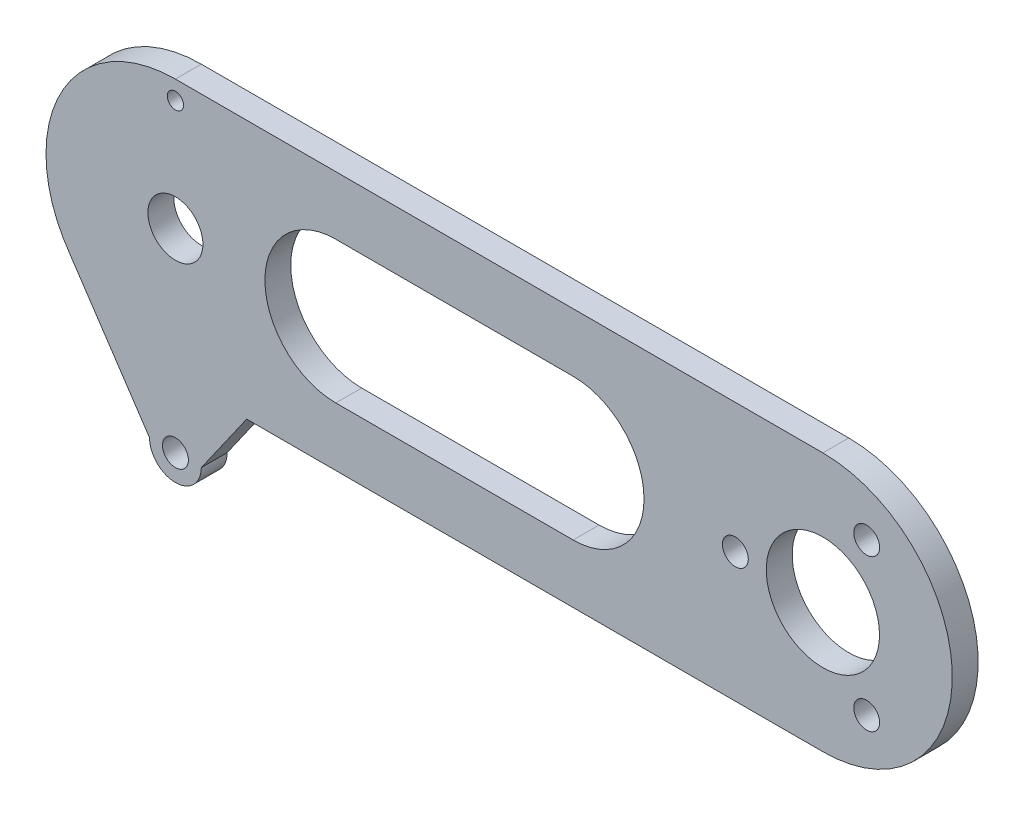
ISO-10303-21;
HEADER;
FILE_DESCRIPTION(('STEP AP214'),'2;1');
FILE_NAME('part.step','',(''),(''),'','','');
FILE_SCHEMA(('AUTOMOTIVE_DESIGN { 1 0 10303 214 1 1 1 1 }'));
ENDSEC;
DATA;
#1=APPLICATION_CONTEXT('core data for automotive mechanical design processes');
#2=APPLICATION_PROTOCOL_DEFINITION('international standard','automotive_design',2000,#1);
#3=PRODUCT_CONTEXT('',#1,'mechanical');
#4=PRODUCT('Part','Part','',(#3));
#5=PRODUCT_RELATED_PRODUCT_CATEGORY('part','',(#4));
#6=PRODUCT_DEFINITION_FORMATION('','',#4);
#7=PRODUCT_DEFINITION_CONTEXT('part definition',#1,'design');
#8=PRODUCT_DEFINITION('design','',#6,#7);
#9=PRODUCT_DEFINITION_SHAPE('','',#8);
#10=(LENGTH_UNIT() NAMED_UNIT(*) SI_UNIT(.MILLI.,.METRE.));
#11=(NAMED_UNIT(*) PLANE_ANGLE_UNIT() SI_UNIT($,.RADIAN.));
#12=(NAMED_UNIT(*) SI_UNIT($,.STERADIAN.) SOLID_ANGLE_UNIT());
#13=UNCERTAINTY_MEASURE_WITH_UNIT(LENGTH_MEASURE(1.E-05),#10,'distance_accuracy_value','');
#14=(GEOMETRIC_REPRESENTATION_CONTEXT(3) GLOBAL_UNCERTAINTY_ASSIGNED_CONTEXT((#13)) GLOBAL_UNIT_ASSIGNED_CONTEXT((#10,
#11,#12)) REPRESENTATION_CONTEXT('',''));
#15=CARTESIAN_POINT('',(0.,0.,0.));
#16=DIRECTION('',(0.,0.,1.));
#17=DIRECTION('',(1.,0.,0.));
#18=AXIS2_PLACEMENT_3D('',#15,#16,#17);
#19=CARTESIAN_POINT('',(-1.00000000000001,0.,4.));
#20=DIRECTION('',(0.,0.,-1.));
#21=DIRECTION('',(-1.,0.,0.));
#22=AXIS2_PLACEMENT_3D('',#19,#20,#21);
#23=PLANE('',#22);
#24=CARTESIAN_POINT('',(105.82929500564,11.7173237132035,4.));
#25=DIRECTION('',(0.,0.,1.));
#26=DIRECTION('',(1.,0.,0.));
#27=AXIS2_PLACEMENT_3D('',#24,#25,#26);
#28=CIRCLE('',#27,2.);
#29=CARTESIAN_POINT('',(107.82929500564,11.7173237132035,4.));
#30=VERTEX_POINT('',#29);
#31=EDGE_CURVE('E156',#30,#30,#28,.T.);
#32=ORIENTED_EDGE('',*,*,#31,.F.);
#33=EDGE_LOOP('',(#32));
#34=FACE_BOUND('',#33,.T.);
#35=CARTESIAN_POINT('',(-0.999999999999992,-30.,4.));
#36=DIRECTION('',(0.,0.,1.));
#37=DIRECTION('',(1.,0.,0.));
#38=AXIS2_PLACEMENT_3D('',#35,#36,#37);
#39=CIRCLE('',#38,2.);
#40=CARTESIAN_POINT('',(1.00000000000001,-30.,4.));
#41=VERTEX_POINT('',#40);
#42=EDGE_CURVE('E162',#41,#41,#39,.T.);
#43=ORIENTED_EDGE('',*,*,#42,.F.);
#44=EDGE_LOOP('',(#43));
#45=FACE_BOUND('',#44,.T.);
#46=CARTESIAN_POINT('',(85.5342950056397,0.,4.));
#47=DIRECTION('',(0.,0.,1.));
#48=DIRECTION('',(1.,0.,0.));
#49=AXIS2_PLACEMENT_3D('',#46,#47,#48);
#50=CIRCLE('',#49,2.);
#51=CARTESIAN_POINT('',(87.5342950056397,0.,4.));
#52=VERTEX_POINT('',#51);
#53=EDGE_CURVE('E168',#52,#52,#50,.T.);
#54=ORIENTED_EDGE('',*,*,#53,.F.);
#55=EDGE_LOOP('',(#54));
#56=FACE_BOUND('',#55,.T.);
#57=CARTESIAN_POINT('',(-0.999999999999996,0.,4.));
#58=DIRECTION('',(0.,0.,1.));
#59=DIRECTION('',(1.,0.,0.));
#60=AXIS2_PLACEMENT_3D('',#57,#58,#59);
#61=CIRCLE('',#60,4.25);
#62=CARTESIAN_POINT('',(3.25,0.,4.));
#63=VERTEX_POINT('',#62);
#64=EDGE_CURVE('E174',#63,#63,#61,.T.);
#65=ORIENTED_EDGE('',*,*,#64,.F.);
#66=EDGE_LOOP('',(#65));
#67=FACE_BOUND('',#66,.T.);
#68=CARTESIAN_POINT('',(-1.00000000000001,0.,4.));
#69=DIRECTION('',(0.,0.,1.));
#70=DIRECTION('',(-1.,0.,0.));
#71=AXIS2_PLACEMENT_3D('',#68,#69,#70);
#72=CIRCLE('',#71,20.);
#73=CARTESIAN_POINT('',(-1.,20.,4.));
#74=VERTEX_POINT('',#73);
#75=CARTESIAN_POINT('',(-17.2081561258522,-11.7173237132034,4.));
#76=VERTEX_POINT('',#75);
#77=EDGE_CURVE('E180',#74,#76,#72,.T.);
#78=ORIENTED_EDGE('',*,*,#77,.T.);
#79=DIRECTION('',(0.555320589704318,-0.83163636443487,0.));
#80=VECTOR('',#79,1.);
#81=CARTESIAN_POINT('',(-4.99999999999999,-30.,4.));
#82=LINE('',#81,#80);
#83=CARTESIAN_POINT('',(-4.99999999999999,-30.,4.));
#84=VERTEX_POINT('',#83);
#85=EDGE_CURVE('E183',#76,#84,#82,.T.);
#86=ORIENTED_EDGE('',*,*,#85,.T.);
#87=CARTESIAN_POINT('',(-0.999999999999992,-30.,4.));
#88=DIRECTION('',(0.,0.,1.));
#89=DIRECTION('',(1.,0.,0.));
#90=AXIS2_PLACEMENT_3D('',#87,#88,#89);
#91=CIRCLE('',#90,4.);
#92=CARTESIAN_POINT('',(3.00000000000001,-30.,4.));
#93=VERTEX_POINT('',#92);
#94=EDGE_CURVE('E186',#84,#93,#91,.T.);
#95=ORIENTED_EDGE('',*,*,#94,.T.);
#96=DIRECTION('',(0.574260620658506,0.818672547213419,0.));
#97=VECTOR('',#96,1.);
#98=CARTESIAN_POINT('',(3.00000000000001,-30.,4.));
#99=LINE('',#98,#97);
#100=CARTESIAN_POINT('',(10.0145337426198,-20.,4.));
#101=VERTEX_POINT('',#100);
#102=EDGE_CURVE('E188',#93,#101,#99,.T.);
#103=ORIENTED_EDGE('',*,*,#102,.T.);
#104=DIRECTION('',(1.,0.,0.));
#105=VECTOR('',#104,1.);
#106=CARTESIAN_POINT('',(10.0145337426198,-20.,4.));
#107=LINE('',#106,#105);
#108=CARTESIAN_POINT('',(99.0642950056397,-20.,4.));
#109=VERTEX_POINT('',#108);
#110=EDGE_CURVE('E190',#101,#109,#107,.T.);
#111=ORIENTED_EDGE('',*,*,#110,.T.);
#112=CARTESIAN_POINT('',(99.0642950056397,0.,4.));
#113=DIRECTION('',(0.,0.,1.));
#114=DIRECTION('',(-1.,0.,0.));
#115=AXIS2_PLACEMENT_3D('',#112,#113,#114);
#116=CIRCLE('',#115,20.);
#117=CARTESIAN_POINT('',(99.0642950056397,20.,4.));
#118=VERTEX_POINT('',#117);
#119=EDGE_CURVE('E192',#109,#118,#116,.T.);
#120=ORIENTED_EDGE('',*,*,#119,.T.);
#121=DIRECTION('',(-1.,0.,0.));
#122=VECTOR('',#121,1.);
#123=CARTESIAN_POINT('',(-1.,20.,4.));
#124=LINE('',#123,#122);
#125=EDGE_CURVE('E194',#118,#74,#124,.T.);
#126=ORIENTED_EDGE('',*,*,#125,.T.);
#127=EDGE_LOOP('',(#78,#86,#95,#103,#111,#120,#126));
#128=FACE_BOUND('',#127,.T.);
#129=CARTESIAN_POINT('',(23.7835213403292,0.,4.));
#130=DIRECTION('',(0.,0.,1.));
#131=DIRECTION('',(1.,0.,0.));
#132=AXIS2_PLACEMENT_3D('',#129,#130,#131);
#133=CIRCLE('',#132,10.953852889672);
#134=CARTESIAN_POINT('',(23.7835213403292,10.953852889672,4.));
#135=VERTEX_POINT('',#134);
#136=CARTESIAN_POINT('',(23.7835213403292,-10.953852889672,4.));
#137=VERTEX_POINT('',#136);
#138=EDGE_CURVE('E117',#135,#137,#133,.T.);
#139=ORIENTED_EDGE('',*,*,#138,.F.);
#140=DIRECTION('',(-1.,0.,0.));
#141=VECTOR('',#140,1.);
#142=CARTESIAN_POINT('',(23.7835213403292,10.953852889672,4.));
#143=LINE('',#142,#141);
#144=CARTESIAN_POINT('',(60.4664786596708,10.953852889672,4.));
#145=VERTEX_POINT('',#144);
#146=EDGE_CURVE('E140',#145,#135,#143,.T.);
#147=ORIENTED_EDGE('',*,*,#146,.F.);
#148=CARTESIAN_POINT('',(60.4664786596708,0.,4.));
#149=DIRECTION('',(0.,0.,1.));
#150=DIRECTION('',(1.,0.,0.));
#151=AXIS2_PLACEMENT_3D('',#148,#149,#150);
#152=CIRCLE('',#151,10.953852889672);
#153=CARTESIAN_POINT('',(60.4664786596708,-10.953852889672,4.));
#154=VERTEX_POINT('',#153);
#155=EDGE_CURVE('E138',#154,#145,#152,.T.);
#156=ORIENTED_EDGE('',*,*,#155,.F.);
#157=DIRECTION('',(1.,0.,0.));
#158=VECTOR('',#157,1.);
#159=CARTESIAN_POINT('',(23.7835213403292,-10.953852889672,4.));
#160=LINE('',#159,#158);
#161=EDGE_CURVE('E125',#137,#154,#160,.T.);
#162=ORIENTED_EDGE('',*,*,#161,.F.);
#163=EDGE_LOOP('',(#139,#147,#156,#162));
#164=FACE_BOUND('',#163,.T.);
#165=CARTESIAN_POINT('',(105.82929500564,-11.7173237132034,4.));
#166=DIRECTION('',(0.,0.,1.));
#167=DIRECTION('',(1.,0.,0.));
#168=AXIS2_PLACEMENT_3D('',#165,#166,#167);
#169=CIRCLE('',#168,2.);
#170=CARTESIAN_POINT('',(107.82929500564,-11.7173237132034,4.));
#171=VERTEX_POINT('',#170);
#172=EDGE_CURVE('E146',#171,#171,#169,.T.);
#173=ORIENTED_EDGE('',*,*,#172,.F.);
#174=EDGE_LOOP('',(#173));
#175=FACE_BOUND('',#174,.T.);
#176=CARTESIAN_POINT('',(99.0642950056397,0.,4.));
#177=DIRECTION('',(0.,0.,1.));
#178=DIRECTION('',(1.,0.,0.));
#179=AXIS2_PLACEMENT_3D('',#176,#177,#178);
#180=CIRCLE('',#179,8.75000000000001);
#181=CARTESIAN_POINT('',(107.81429500564,0.,4.));
#182=VERTEX_POINT('',#181);
#183=EDGE_CURVE('E331',#182,#182,#180,.T.);
#184=ORIENTED_EDGE('',*,*,#183,.F.);
#185=EDGE_LOOP('',(#184));
#186=FACE_BOUND('',#185,.T.);
#187=CARTESIAN_POINT('',(-0.999999999999998,17.12,4.));
#188=DIRECTION('',(0.,0.,1.));
#189=DIRECTION('',(1.,0.,0.));
#190=AXIS2_PLACEMENT_3D('',#187,#188,#189);
#191=CIRCLE('',#190,1.25);
#192=CARTESIAN_POINT('',(0.250000000000003,17.12,4.));
#193=VERTEX_POINT('',#192);
#194=EDGE_CURVE('E322',#193,#193,#191,.T.);
#195=ORIENTED_EDGE('',*,*,#194,.F.);
#196=EDGE_LOOP('',(#195));
#197=FACE_BOUND('',#196,.T.);
#198=ADVANCED_FACE('F34',(#34,#45,#56,#67,#128,#164,#175,#186,#197),#23,.F.);
#199=CARTESIAN_POINT('',(-1.00000000000001,0.,0.));
#200=DIRECTION('',(0.,0.,-1.));
#201=DIRECTION('',(-1.,0.,0.));
#202=AXIS2_PLACEMENT_3D('',#199,#200,#201);
#203=PLANE('',#202);
#204=CARTESIAN_POINT('',(99.0642950056397,0.,0.));
#205=DIRECTION('',(0.,0.,1.));
#206=DIRECTION('',(1.,0.,0.));
#207=AXIS2_PLACEMENT_3D('',#204,#205,#206);
#208=CIRCLE('',#207,8.75000000000001);
#209=CARTESIAN_POINT('',(107.81429500564,0.,0.));
#210=VERTEX_POINT('',#209);
#211=EDGE_CURVE('E328',#210,#210,#208,.T.);
#212=ORIENTED_EDGE('',*,*,#211,.T.);
#213=EDGE_LOOP('',(#212));
#214=FACE_BOUND('',#213,.T.);
#215=DIRECTION('',(-1.,0.,0.));
#216=VECTOR('',#215,1.);
#217=CARTESIAN_POINT('',(23.7835213403292,10.953852889672,0.));
#218=LINE('',#217,#216);
#219=CARTESIAN_POINT('',(60.4664786596708,10.953852889672,0.));
#220=VERTEX_POINT('',#219);
#221=CARTESIAN_POINT('',(23.7835213403292,10.953852889672,0.));
#222=VERTEX_POINT('',#221);
#223=EDGE_CURVE('E126',#220,#222,#218,.T.);
#224=ORIENTED_EDGE('',*,*,#223,.T.);
#225=CARTESIAN_POINT('',(23.7835213403292,0.,0.));
#226=DIRECTION('',(0.,0.,1.));
#227=DIRECTION('',(1.,0.,0.));
#228=AXIS2_PLACEMENT_3D('',#225,#226,#227);
#229=CIRCLE('',#228,10.953852889672);
#230=CARTESIAN_POINT('',(23.7835213403292,-10.953852889672,0.));
#231=VERTEX_POINT('',#230);
#232=EDGE_CURVE('E57',#222,#231,#229,.T.);
#233=ORIENTED_EDGE('',*,*,#232,.T.);
#234=DIRECTION('',(1.,0.,0.));
#235=VECTOR('',#234,1.);
#236=CARTESIAN_POINT('',(23.7835213403292,-10.953852889672,0.));
#237=LINE('',#236,#235);
#238=CARTESIAN_POINT('',(60.4664786596708,-10.953852889672,0.));
#239=VERTEX_POINT('',#238);
#240=EDGE_CURVE('E132',#231,#239,#237,.T.);
#241=ORIENTED_EDGE('',*,*,#240,.T.);
#242=CARTESIAN_POINT('',(60.4664786596708,0.,0.));
#243=DIRECTION('',(0.,0.,1.));
#244=DIRECTION('',(1.,0.,0.));
#245=AXIS2_PLACEMENT_3D('',#242,#243,#244);
#246=CIRCLE('',#245,10.953852889672);
#247=EDGE_CURVE('E148',#239,#220,#246,.T.);
#248=ORIENTED_EDGE('',*,*,#247,.T.);
#249=EDGE_LOOP('',(#224,#233,#241,#248));
#250=FACE_BOUND('',#249,.T.);
#251=CARTESIAN_POINT('',(105.82929500564,11.7173237132035,0.));
#252=DIRECTION('',(0.,0.,1.));
#253=DIRECTION('',(1.,0.,0.));
#254=AXIS2_PLACEMENT_3D('',#251,#252,#253);
#255=CIRCLE('',#254,2.);
#256=CARTESIAN_POINT('',(107.82929500564,11.7173237132035,0.));
#257=VERTEX_POINT('',#256);
#258=EDGE_CURVE('E133',#257,#257,#255,.T.);
#259=ORIENTED_EDGE('',*,*,#258,.T.);
#260=EDGE_LOOP('',(#259));
#261=FACE_BOUND('',#260,.T.);
#262=CARTESIAN_POINT('',(85.5342950056397,0.,0.));
#263=DIRECTION('',(0.,0.,1.));
#264=DIRECTION('',(1.,0.,0.));
#265=AXIS2_PLACEMENT_3D('',#262,#263,#264);
#266=CIRCLE('',#265,2.);
#267=CARTESIAN_POINT('',(87.5342950056397,0.,0.));
#268=VERTEX_POINT('',#267);
#269=EDGE_CURVE('E165',#268,#268,#266,.T.);
#270=ORIENTED_EDGE('',*,*,#269,.T.);
#271=EDGE_LOOP('',(#270));
#272=FACE_BOUND('',#271,.T.);
#273=CARTESIAN_POINT('',(-1.00000000000001,0.,0.));
#274=DIRECTION('',(0.,0.,1.));
#275=DIRECTION('',(-1.,0.,0.));
#276=AXIS2_PLACEMENT_3D('',#273,#274,#275);
#277=CIRCLE('',#276,20.);
#278=CARTESIAN_POINT('',(-1.,20.,0.));
#279=VERTEX_POINT('',#278);
#280=CARTESIAN_POINT('',(-17.2081561258522,-11.7173237132034,0.));
#281=VERTEX_POINT('',#280);
#282=EDGE_CURVE('E177',#279,#281,#277,.T.);
#283=ORIENTED_EDGE('',*,*,#282,.F.);
#284=DIRECTION('',(-1.,0.,0.));
#285=VECTOR('',#284,1.);
#286=CARTESIAN_POINT('',(-1.,20.,0.));
#287=LINE('',#286,#285);
#288=CARTESIAN_POINT('',(99.0642950056397,20.,0.));
#289=VERTEX_POINT('',#288);
#290=EDGE_CURVE('E184',#289,#279,#287,.T.);
#291=ORIENTED_EDGE('',*,*,#290,.F.);
#292=CARTESIAN_POINT('',(99.0642950056397,0.,0.));
#293=DIRECTION('',(0.,0.,1.));
#294=DIRECTION('',(-1.,0.,0.));
#295=AXIS2_PLACEMENT_3D('',#292,#293,#294);
#296=CIRCLE('',#295,20.);
#297=CARTESIAN_POINT('',(99.0642950056397,-20.,0.));
#298=VERTEX_POINT('',#297);
#299=EDGE_CURVE('E207',#298,#289,#296,.T.);
#300=ORIENTED_EDGE('',*,*,#299,.F.);
#301=DIRECTION('',(1.,0.,0.));
#302=VECTOR('',#301,1.);
#303=CARTESIAN_POINT('',(10.0145337426198,-20.,0.));
#304=LINE('',#303,#302);
#305=CARTESIAN_POINT('',(10.0145337426198,-20.,0.));
#306=VERTEX_POINT('',#305);
#307=EDGE_CURVE('E205',#306,#298,#304,.T.);
#308=ORIENTED_EDGE('',*,*,#307,.F.);
#309=DIRECTION('',(0.574260620658506,0.818672547213419,0.));
#310=VECTOR('',#309,1.);
#311=CARTESIAN_POINT('',(3.00000000000001,-30.,0.));
#312=LINE('',#311,#310);
#313=CARTESIAN_POINT('',(3.00000000000001,-30.,0.));
#314=VERTEX_POINT('',#313);
#315=EDGE_CURVE('E203',#314,#306,#312,.T.);
#316=ORIENTED_EDGE('',*,*,#315,.F.);
#317=CARTESIAN_POINT('',(-0.999999999999992,-30.,0.));
#318=DIRECTION('',(0.,0.,1.));
#319=DIRECTION('',(1.,0.,0.));
#320=AXIS2_PLACEMENT_3D('',#317,#318,#319);
#321=CIRCLE('',#320,4.);
#322=CARTESIAN_POINT('',(-4.99999999999999,-30.,0.));
#323=VERTEX_POINT('',#322);
#324=EDGE_CURVE('E201',#323,#314,#321,.T.);
#325=ORIENTED_EDGE('',*,*,#324,.F.);
#326=DIRECTION('',(0.555320589704318,-0.83163636443487,0.));
#327=VECTOR('',#326,1.);
#328=CARTESIAN_POINT('',(-4.99999999999999,-30.,0.));
#329=LINE('',#328,#327);
#330=EDGE_CURVE('E199',#281,#323,#329,.T.);
#331=ORIENTED_EDGE('',*,*,#330,.F.);
#332=EDGE_LOOP('',(#283,#291,#300,#308,#316,#325,#331));
#333=FACE_BOUND('',#332,.T.);
#334=CARTESIAN_POINT('',(-0.999999999999996,0.,0.));
#335=DIRECTION('',(0.,0.,1.));
#336=DIRECTION('',(1.,0.,0.));
#337=AXIS2_PLACEMENT_3D('',#334,#335,#336);
#338=CIRCLE('',#337,4.25);
#339=CARTESIAN_POINT('',(3.25,0.,0.));
#340=VERTEX_POINT('',#339);
#341=EDGE_CURVE('E171',#340,#340,#338,.T.);
#342=ORIENTED_EDGE('',*,*,#341,.T.);
#343=EDGE_LOOP('',(#342));
#344=FACE_BOUND('',#343,.T.);
#345=CARTESIAN_POINT('',(-0.999999999999992,-30.,0.));
#346=DIRECTION('',(0.,0.,1.));
#347=DIRECTION('',(1.,0.,0.));
#348=AXIS2_PLACEMENT_3D('',#345,#346,#347);
#349=CIRCLE('',#348,2.);
#350=CARTESIAN_POINT('',(1.00000000000001,-30.,0.));
#351=VERTEX_POINT('',#350);
#352=EDGE_CURVE('E159',#351,#351,#349,.T.);
#353=ORIENTED_EDGE('',*,*,#352,.T.);
#354=EDGE_LOOP('',(#353));
#355=FACE_BOUND('',#354,.T.);
#356=CARTESIAN_POINT('',(105.82929500564,-11.7173237132034,0.));
#357=DIRECTION('',(0.,0.,1.));
#358=DIRECTION('',(1.,0.,0.));
#359=AXIS2_PLACEMENT_3D('',#356,#357,#358);
#360=CIRCLE('',#359,2.);
#361=CARTESIAN_POINT('',(107.82929500564,-11.7173237132034,0.));
#362=VERTEX_POINT('',#361);
#363=EDGE_CURVE('E334',#362,#362,#360,.T.);
#364=ORIENTED_EDGE('',*,*,#363,.T.);
#365=EDGE_LOOP('',(#364));
#366=FACE_BOUND('',#365,.T.);
#367=CARTESIAN_POINT('',(-0.999999999999998,17.12,0.));
#368=DIRECTION('',(0.,0.,1.));
#369=DIRECTION('',(1.,0.,0.));
#370=AXIS2_PLACEMENT_3D('',#367,#368,#369);
#371=CIRCLE('',#370,1.25);
#372=CARTESIAN_POINT('',(0.250000000000003,17.12,0.));
#373=VERTEX_POINT('',#372);
#374=EDGE_CURVE('E325',#373,#373,#371,.T.);
#375=ORIENTED_EDGE('',*,*,#374,.T.);
#376=EDGE_LOOP('',(#375));
#377=FACE_BOUND('',#376,.T.);
#378=ADVANCED_FACE('F234',(#214,#250,#261,#272,#333,#344,#355,#366,#377),#203,.T.);
#379=CARTESIAN_POINT('',(-1.00000000000001,0.,4.));
#380=DIRECTION('',(0.,0.,-1.));
#381=DIRECTION('',(-1.,0.,0.));
#382=AXIS2_PLACEMENT_3D('',#379,#380,#381);
#383=CYLINDRICAL_SURFACE('',#382,20.);
#384=ORIENTED_EDGE('',*,*,#282,.T.);
#385=DIRECTION('',(0.,0.,-1.));
#386=VECTOR('',#385,1.);
#387=CARTESIAN_POINT('',(-17.2081561258522,-11.7173237132034,4.));
#388=LINE('',#387,#386);
#389=EDGE_CURVE('E11',#76,#281,#388,.T.);
#390=ORIENTED_EDGE('',*,*,#389,.F.);
#391=ORIENTED_EDGE('',*,*,#77,.F.);
#392=DIRECTION('',(0.,0.,-1.));
#393=VECTOR('',#392,1.);
#394=CARTESIAN_POINT('',(-1.,20.,4.));
#395=LINE('',#394,#393);
#396=EDGE_CURVE('E196',#74,#279,#395,.T.);
#397=ORIENTED_EDGE('',*,*,#396,.T.);
#398=EDGE_LOOP('',(#384,#390,#391,#397));
#399=FACE_BOUND('',#398,.T.);
#400=ADVANCED_FACE('F36',(#399),#383,.T.);
#401=CARTESIAN_POINT('',(-4.99999999999999,-30.,4.));
#402=DIRECTION('',(0.83163636443487,0.555320589704318,0.));
#403=DIRECTION('',(-0.555320589704318,0.83163636443487,0.));
#404=AXIS2_PLACEMENT_3D('',#401,#402,#403);
#405=PLANE('',#404);
#406=ORIENTED_EDGE('',*,*,#330,.T.);
#407=DIRECTION('',(0.,0.,-1.));
#408=VECTOR('',#407,1.);
#409=CARTESIAN_POINT('',(-4.99999999999999,-30.,4.));
#410=LINE('',#409,#408);
#411=EDGE_CURVE('E42',#84,#323,#410,.T.);
#412=ORIENTED_EDGE('',*,*,#411,.F.);
#413=ORIENTED_EDGE('',*,*,#85,.F.);
#414=ORIENTED_EDGE('',*,*,#389,.T.);
#415=EDGE_LOOP('',(#406,#412,#413,#414));
#416=FACE_BOUND('',#415,.T.);
#417=ADVANCED_FACE('F251',(#416),#405,.F.);
#418=CARTESIAN_POINT('',(-0.999999999999992,-30.,4.));
#419=DIRECTION('',(0.,0.,-1.));
#420=DIRECTION('',(-1.,0.,0.));
#421=AXIS2_PLACEMENT_3D('',#418,#419,#420);
#422=CYLINDRICAL_SURFACE('',#421,4.);
#423=ORIENTED_EDGE('',*,*,#324,.T.);
#424=DIRECTION('',(0.,0.,-1.));
#425=VECTOR('',#424,1.);
#426=CARTESIAN_POINT('',(3.00000000000001,-30.,4.));
#427=LINE('',#426,#425);
#428=EDGE_CURVE('E221',#93,#314,#427,.T.);
#429=ORIENTED_EDGE('',*,*,#428,.F.);
#430=ORIENTED_EDGE('',*,*,#94,.F.);
#431=ORIENTED_EDGE('',*,*,#411,.T.);
#432=EDGE_LOOP('',(#423,#429,#430,#431));
#433=FACE_BOUND('',#432,.T.);
#434=ADVANCED_FACE('F228',(#433),#422,.T.);
#435=CARTESIAN_POINT('',(3.00000000000001,-30.,4.));
#436=DIRECTION('',(-0.818672547213419,0.574260620658506,0.));
#437=DIRECTION('',(-0.574260620658506,-0.818672547213419,0.));
#438=AXIS2_PLACEMENT_3D('',#435,#436,#437);
#439=PLANE('',#438);
#440=ORIENTED_EDGE('',*,*,#315,.T.);
#441=DIRECTION('',(0.,0.,-1.));
#442=VECTOR('',#441,1.);
#443=CARTESIAN_POINT('',(10.0145337426198,-20.,4.));
#444=LINE('',#443,#442);
#445=EDGE_CURVE('E218',#101,#306,#444,.T.);
#446=ORIENTED_EDGE('',*,*,#445,.F.);
#447=ORIENTED_EDGE('',*,*,#102,.F.);
#448=ORIENTED_EDGE('',*,*,#428,.T.);
#449=EDGE_LOOP('',(#440,#446,#447,#448));
#450=FACE_BOUND('',#449,.T.);
#451=ADVANCED_FACE('F240',(#450),#439,.F.);
#452=CARTESIAN_POINT('',(10.0145337426198,-20.,4.));
#453=DIRECTION('',(0.,1.,0.));
#454=DIRECTION('',(-1.,0.,0.));
#455=AXIS2_PLACEMENT_3D('',#452,#453,#454);
#456=PLANE('',#455);
#457=ORIENTED_EDGE('',*,*,#307,.T.);
#458=DIRECTION('',(0.,0.,-1.));
#459=VECTOR('',#458,1.);
#460=CARTESIAN_POINT('',(99.0642950056397,-20.,4.));
#461=LINE('',#460,#459);
#462=EDGE_CURVE('E215',#109,#298,#461,.T.);
#463=ORIENTED_EDGE('',*,*,#462,.F.);
#464=ORIENTED_EDGE('',*,*,#110,.F.);
#465=ORIENTED_EDGE('',*,*,#445,.T.);
#466=EDGE_LOOP('',(#457,#463,#464,#465));
#467=FACE_BOUND('',#466,.T.);
#468=ADVANCED_FACE('F244',(#467),#456,.F.);
#469=CARTESIAN_POINT('',(99.0642950056397,0.,4.));
#470=DIRECTION('',(0.,0.,-1.));
#471=DIRECTION('',(-1.,0.,0.));
#472=AXIS2_PLACEMENT_3D('',#469,#470,#471);
#473=CYLINDRICAL_SURFACE('',#472,20.);
#474=ORIENTED_EDGE('',*,*,#299,.T.);
#475=DIRECTION('',(0.,0.,-1.));
#476=VECTOR('',#475,1.);
#477=CARTESIAN_POINT('',(99.0642950056397,20.,4.));
#478=LINE('',#477,#476);
#479=EDGE_CURVE('E212',#118,#289,#478,.T.);
#480=ORIENTED_EDGE('',*,*,#479,.F.);
#481=ORIENTED_EDGE('',*,*,#119,.F.);
#482=ORIENTED_EDGE('',*,*,#462,.T.);
#483=EDGE_LOOP('',(#474,#480,#481,#482));
#484=FACE_BOUND('',#483,.T.);
#485=ADVANCED_FACE('F259',(#484),#473,.T.);
#486=CARTESIAN_POINT('',(-1.,20.,4.));
#487=DIRECTION('',(0.,-1.,0.));
#488=DIRECTION('',(0.,0.,-1.));
#489=AXIS2_PLACEMENT_3D('',#486,#487,#488);
#490=PLANE('',#489);
#491=ORIENTED_EDGE('',*,*,#290,.T.);
#492=ORIENTED_EDGE('',*,*,#396,.F.);
#493=ORIENTED_EDGE('',*,*,#125,.F.);
#494=ORIENTED_EDGE('',*,*,#479,.T.);
#495=EDGE_LOOP('',(#491,#492,#493,#494));
#496=FACE_BOUND('',#495,.T.);
#497=ADVANCED_FACE('F256',(#496),#490,.F.);
#498=CARTESIAN_POINT('',(-0.999999999999996,0.,4.));
#499=DIRECTION('',(0.,0.,-1.));
#500=DIRECTION('',(-1.,0.,0.));
#501=AXIS2_PLACEMENT_3D('',#498,#499,#500);
#502=CYLINDRICAL_SURFACE('',#501,4.25);
#503=ORIENTED_EDGE('',*,*,#64,.T.);
#504=EDGE_LOOP('',(#503));
#505=FACE_BOUND('',#504,.T.);
#506=ORIENTED_EDGE('',*,*,#341,.F.);
#507=EDGE_LOOP('',(#506));
#508=FACE_BOUND('',#507,.T.);
#509=ADVANCED_FACE('F266',(#505,#508),#502,.F.);
#510=CARTESIAN_POINT('',(85.5342950056397,0.,4.));
#511=DIRECTION('',(0.,0.,-1.));
#512=DIRECTION('',(-1.,0.,0.));
#513=AXIS2_PLACEMENT_3D('',#510,#511,#512);
#514=CYLINDRICAL_SURFACE('',#513,2.);
#515=ORIENTED_EDGE('',*,*,#53,.T.);
#516=EDGE_LOOP('',(#515));
#517=FACE_BOUND('',#516,.T.);
#518=ORIENTED_EDGE('',*,*,#269,.F.);
#519=EDGE_LOOP('',(#518));
#520=FACE_BOUND('',#519,.T.);
#521=ADVANCED_FACE('F282',(#517,#520),#514,.F.);
#522=CARTESIAN_POINT('',(-0.999999999999992,-30.,4.));
#523=DIRECTION('',(0.,0.,-1.));
#524=DIRECTION('',(-1.,0.,0.));
#525=AXIS2_PLACEMENT_3D('',#522,#523,#524);
#526=CYLINDRICAL_SURFACE('',#525,2.);
#527=ORIENTED_EDGE('',*,*,#42,.T.);
#528=EDGE_LOOP('',(#527));
#529=FACE_BOUND('',#528,.T.);
#530=ORIENTED_EDGE('',*,*,#352,.F.);
#531=EDGE_LOOP('',(#530));
#532=FACE_BOUND('',#531,.T.);
#533=ADVANCED_FACE('F286',(#529,#532),#526,.F.);
#534=CARTESIAN_POINT('',(105.82929500564,11.7173237132035,4.));
#535=DIRECTION('',(0.,0.,-1.));
#536=DIRECTION('',(-1.,0.,0.));
#537=AXIS2_PLACEMENT_3D('',#534,#535,#536);
#538=CYLINDRICAL_SURFACE('',#537,2.);
#539=ORIENTED_EDGE('',*,*,#31,.T.);
#540=EDGE_LOOP('',(#539));
#541=FACE_BOUND('',#540,.T.);
#542=ORIENTED_EDGE('',*,*,#258,.F.);
#543=EDGE_LOOP('',(#542));
#544=FACE_BOUND('',#543,.T.);
#545=ADVANCED_FACE('F290',(#541,#544),#538,.F.);
#546=CARTESIAN_POINT('',(23.7835213403292,0.,4.));
#547=DIRECTION('',(0.,0.,-1.));
#548=DIRECTION('',(-1.,0.,0.));
#549=AXIS2_PLACEMENT_3D('',#546,#547,#548);
#550=CYLINDRICAL_SURFACE('',#549,10.953852889672);
#551=ORIENTED_EDGE('',*,*,#232,.F.);
#552=DIRECTION('',(0.,0.,-1.));
#553=VECTOR('',#552,1.);
#554=CARTESIAN_POINT('',(23.7835213403292,10.953852889672,4.));
#555=LINE('',#554,#553);
#556=EDGE_CURVE('E121',#135,#222,#555,.T.);
#557=ORIENTED_EDGE('',*,*,#556,.F.);
#558=ORIENTED_EDGE('',*,*,#138,.T.);
#559=DIRECTION('',(0.,0.,-1.));
#560=VECTOR('',#559,1.);
#561=CARTESIAN_POINT('',(23.7835213403292,-10.953852889672,4.));
#562=LINE('',#561,#560);
#563=EDGE_CURVE('E120',#137,#231,#562,.T.);
#564=ORIENTED_EDGE('',*,*,#563,.T.);
#565=EDGE_LOOP('',(#551,#557,#558,#564));
#566=FACE_BOUND('',#565,.T.);
#567=ADVANCED_FACE('F119',(#566),#550,.F.);
#568=CARTESIAN_POINT('',(23.7835213403292,-10.953852889672,4.));
#569=DIRECTION('',(0.,1.,0.));
#570=DIRECTION('',(-1.,0.,0.));
#571=AXIS2_PLACEMENT_3D('',#568,#569,#570);
#572=PLANE('',#571);
#573=ORIENTED_EDGE('',*,*,#240,.F.);
#574=ORIENTED_EDGE('',*,*,#563,.F.);
#575=ORIENTED_EDGE('',*,*,#161,.T.);
#576=DIRECTION('',(0.,0.,-1.));
#577=VECTOR('',#576,1.);
#578=CARTESIAN_POINT('',(60.4664786596708,-10.953852889672,4.));
#579=LINE('',#578,#577);
#580=EDGE_CURVE('E134',#154,#239,#579,.T.);
#581=ORIENTED_EDGE('',*,*,#580,.T.);
#582=EDGE_LOOP('',(#573,#574,#575,#581));
#583=FACE_BOUND('',#582,.T.);
#584=ADVANCED_FACE('F129',(#583),#572,.T.);
#585=CARTESIAN_POINT('',(60.4664786596708,0.,4.));
#586=DIRECTION('',(0.,0.,-1.));
#587=DIRECTION('',(-1.,0.,0.));
#588=AXIS2_PLACEMENT_3D('',#585,#586,#587);
#589=CYLINDRICAL_SURFACE('',#588,10.953852889672);
#590=ORIENTED_EDGE('',*,*,#247,.F.);
#591=ORIENTED_EDGE('',*,*,#580,.F.);
#592=ORIENTED_EDGE('',*,*,#155,.T.);
#593=DIRECTION('',(0.,0.,-1.));
#594=VECTOR('',#593,1.);
#595=CARTESIAN_POINT('',(60.4664786596708,10.953852889672,4.));
#596=LINE('',#595,#594);
#597=EDGE_CURVE('E49',#145,#220,#596,.T.);
#598=ORIENTED_EDGE('',*,*,#597,.T.);
#599=EDGE_LOOP('',(#590,#591,#592,#598));
#600=FACE_BOUND('',#599,.T.);
#601=ADVANCED_FACE('F299',(#600),#589,.F.);
#602=CARTESIAN_POINT('',(23.7835213403292,10.953852889672,4.));
#603=DIRECTION('',(0.,-1.,0.));
#604=DIRECTION('',(1.,0.,0.));
#605=AXIS2_PLACEMENT_3D('',#602,#603,#604);
#606=PLANE('',#605);
#607=ORIENTED_EDGE('',*,*,#223,.F.);
#608=ORIENTED_EDGE('',*,*,#597,.F.);
#609=ORIENTED_EDGE('',*,*,#146,.T.);
#610=ORIENTED_EDGE('',*,*,#556,.T.);
#611=EDGE_LOOP('',(#607,#608,#609,#610));
#612=FACE_BOUND('',#611,.T.);
#613=ADVANCED_FACE('F302',(#612),#606,.T.);
#614=CARTESIAN_POINT('',(105.82929500564,-11.7173237132034,4.));
#615=DIRECTION('',(0.,0.,-1.));
#616=DIRECTION('',(-1.,0.,0.));
#617=AXIS2_PLACEMENT_3D('',#614,#615,#616);
#618=CYLINDRICAL_SURFACE('',#617,2.);
#619=ORIENTED_EDGE('',*,*,#172,.T.);
#620=EDGE_LOOP('',(#619));
#621=FACE_BOUND('',#620,.T.);
#622=ORIENTED_EDGE('',*,*,#363,.F.);
#623=EDGE_LOOP('',(#622));
#624=FACE_BOUND('',#623,.T.);
#625=ADVANCED_FACE('F306',(#621,#624),#618,.F.);
#626=CARTESIAN_POINT('',(99.0642950056397,0.,4.));
#627=DIRECTION('',(0.,0.,-1.));
#628=DIRECTION('',(-1.,0.,0.));
#629=AXIS2_PLACEMENT_3D('',#626,#627,#628);
#630=CYLINDRICAL_SURFACE('',#629,8.75000000000001);
#631=ORIENTED_EDGE('',*,*,#183,.T.);
#632=EDGE_LOOP('',(#631));
#633=FACE_BOUND('',#632,.T.);
#634=ORIENTED_EDGE('',*,*,#211,.F.);
#635=EDGE_LOOP('',(#634));
#636=FACE_BOUND('',#635,.T.);
#637=ADVANCED_FACE('F309',(#633,#636),#630,.F.);
#638=CARTESIAN_POINT('',(-0.999999999999998,17.12,4.));
#639=DIRECTION('',(0.,0.,-1.));
#640=DIRECTION('',(-1.,0.,0.));
#641=AXIS2_PLACEMENT_3D('',#638,#639,#640);
#642=CYLINDRICAL_SURFACE('',#641,1.25);
#643=ORIENTED_EDGE('',*,*,#194,.T.);
#644=EDGE_LOOP('',(#643));
#645=FACE_BOUND('',#644,.T.);
#646=ORIENTED_EDGE('',*,*,#374,.F.);
#647=EDGE_LOOP('',(#646));
#648=FACE_BOUND('',#647,.T.);
#649=ADVANCED_FACE('F313',(#645,#648),#642,.F.);
#650=CLOSED_SHELL('',(#198,#378,#400,#417,#434,#451,#468,#485,#497,#509,#521,#533,#545,#567,
#584,#601,#613,#625,#637,#649));
#651=MANIFOLD_SOLID_BREP('B2',#650);
#652=ADVANCED_BREP_SHAPE_REPRESENTATION('',(#18,#651),#14);
#653=SHAPE_DEFINITION_REPRESENTATION(#9,#652);
ENDSEC;
END-ISO-10303-21;
